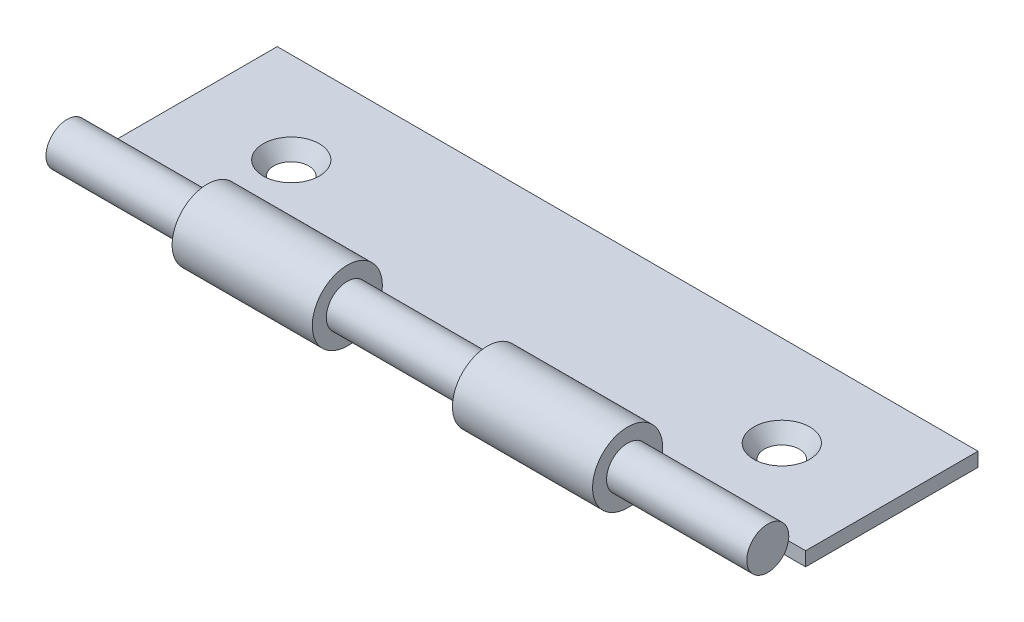
ISO-10303-21;
HEADER;
FILE_DESCRIPTION(('STEP AP214'),'2;1');
FILE_NAME('part.step','',(''),(''),'','','');
FILE_SCHEMA(('AUTOMOTIVE_DESIGN { 1 0 10303 214 1 1 1 1 }'));
ENDSEC;
DATA;
#1=APPLICATION_CONTEXT('core data for automotive mechanical design processes');
#2=APPLICATION_PROTOCOL_DEFINITION('international standard','automotive_design',2000,#1);
#3=PRODUCT_CONTEXT('',#1,'mechanical');
#4=PRODUCT('Part','Part','',(#3));
#5=PRODUCT_RELATED_PRODUCT_CATEGORY('part','',(#4));
#6=PRODUCT_DEFINITION_FORMATION('','',#4);
#7=PRODUCT_DEFINITION_CONTEXT('part definition',#1,'design');
#8=PRODUCT_DEFINITION('design','',#6,#7);
#9=PRODUCT_DEFINITION_SHAPE('','',#8);
#10=(LENGTH_UNIT() NAMED_UNIT(*) SI_UNIT(.MILLI.,.METRE.));
#11=(NAMED_UNIT(*) PLANE_ANGLE_UNIT() SI_UNIT($,.RADIAN.));
#12=(NAMED_UNIT(*) SI_UNIT($,.STERADIAN.) SOLID_ANGLE_UNIT());
#13=UNCERTAINTY_MEASURE_WITH_UNIT(LENGTH_MEASURE(1.E-05),#10,'distance_accuracy_value','');
#14=(GEOMETRIC_REPRESENTATION_CONTEXT(3) GLOBAL_UNCERTAINTY_ASSIGNED_CONTEXT((#13)) GLOBAL_UNIT_ASSIGNED_CONTEXT((#10,
#11,#12)) REPRESENTATION_CONTEXT('',''));
#15=CARTESIAN_POINT('',(0.,0.,0.));
#16=DIRECTION('',(0.,0.,1.));
#17=DIRECTION('',(1.,0.,0.));
#18=AXIS2_PLACEMENT_3D('',#15,#16,#17);
#19=CARTESIAN_POINT('',(50.,0.,0.));
#20=DIRECTION('',(-1.,0.,0.));
#21=DIRECTION('',(0.,0.,1.));
#22=AXIS2_PLACEMENT_3D('',#19,#20,#21);
#23=CYLINDRICAL_SURFACE('',#22,2.5);
#24=CARTESIAN_POINT('',(40.,0.,0.));
#25=DIRECTION('',(-1.,0.,0.));
#26=DIRECTION('',(0.,0.,1.));
#27=AXIS2_PLACEMENT_3D('',#24,#25,#26);
#28=CIRCLE('',#27,2.5);
#29=CARTESIAN_POINT('',(40.,-2.5,0.));
#30=VERTEX_POINT('',#29);
#31=CARTESIAN_POINT('',(40.,-1.21202405061584,-2.18654926784849));
#32=VERTEX_POINT('',#31);
#33=EDGE_CURVE('E10',#30,#32,#28,.T.);
#34=ORIENTED_EDGE('',*,*,#33,.T.);
#35=DIRECTION('',(-1.,0.,0.));
#36=VECTOR('',#35,1.);
#37=CARTESIAN_POINT('',(50.,-1.21202405061584,-2.18654926784849));
#38=LINE('',#37,#36);
#39=CARTESIAN_POINT('',(30.,-1.21202405061584,-2.18654926784849));
#40=VERTEX_POINT('',#39);
#41=EDGE_CURVE('E296',#32,#40,#38,.T.);
#42=ORIENTED_EDGE('',*,*,#41,.T.);
#43=CARTESIAN_POINT('',(30.,0.,0.));
#44=DIRECTION('',(1.,0.,0.));
#45=DIRECTION('',(0.,0.,-1.));
#46=AXIS2_PLACEMENT_3D('',#43,#44,#45);
#47=CIRCLE('',#46,2.5);
#48=CARTESIAN_POINT('',(30.,-2.5,0.));
#49=VERTEX_POINT('',#48);
#50=EDGE_CURVE('E227',#40,#49,#47,.T.);
#51=ORIENTED_EDGE('',*,*,#50,.T.);
#52=DIRECTION('',(-1.,0.,0.));
#53=VECTOR('',#52,1.);
#54=CARTESIAN_POINT('',(50.,-2.5,0.));
#55=LINE('',#54,#53);
#56=EDGE_CURVE('E177',#30,#49,#55,.T.);
#57=ORIENTED_EDGE('',*,*,#56,.F.);
#58=EDGE_LOOP('',(#34,#42,#51,#57));
#59=FACE_BOUND('',#58,.T.);
#60=ADVANCED_FACE('F15',(#59),#23,.T.);
#61=CARTESIAN_POINT('',(20.,0.,0.));
#62=DIRECTION('',(-1.,0.,0.));
#63=DIRECTION('',(0.,0.,1.));
#64=AXIS2_PLACEMENT_3D('',#61,#62,#63);
#65=CIRCLE('',#64,2.5);
#66=CARTESIAN_POINT('',(20.,-2.5,0.));
#67=VERTEX_POINT('',#66);
#68=CARTESIAN_POINT('',(20.,-1.21202405061584,-2.18654926784849));
#69=VERTEX_POINT('',#68);
#70=EDGE_CURVE('E214',#67,#69,#65,.T.);
#71=ORIENTED_EDGE('',*,*,#70,.T.);
#72=CARTESIAN_POINT('',(10.,-1.21202405061584,-2.18654926784849));
#73=VERTEX_POINT('',#72);
#74=EDGE_CURVE('E295',#69,#73,#38,.T.);
#75=ORIENTED_EDGE('',*,*,#74,.T.);
#76=CARTESIAN_POINT('',(10.,0.,0.));
#77=DIRECTION('',(1.,0.,0.));
#78=DIRECTION('',(0.,0.,-1.));
#79=AXIS2_PLACEMENT_3D('',#76,#77,#78);
#80=CIRCLE('',#79,2.5);
#81=CARTESIAN_POINT('',(10.,-2.5,0.));
#82=VERTEX_POINT('',#81);
#83=EDGE_CURVE('E254',#73,#82,#80,.T.);
#84=ORIENTED_EDGE('',*,*,#83,.T.);
#85=EDGE_CURVE('E176',#67,#82,#55,.T.);
#86=ORIENTED_EDGE('',*,*,#85,.F.);
#87=EDGE_LOOP('',(#71,#75,#84,#86));
#88=FACE_BOUND('',#87,.T.);
#89=ADVANCED_FACE('F308',(#88),#23,.T.);
#90=CARTESIAN_POINT('',(50.,-0.727214430369505,-1.31192956070909));
#91=DIRECTION('',(0.,0.874619707139396,-0.484809620246337));
#92=DIRECTION('',(0.,0.484809620246337,0.874619707139396));
#93=AXIS2_PLACEMENT_3D('',#90,#91,#92);
#94=PLANE('',#93);
#95=ORIENTED_EDGE('',*,*,#41,.F.);
#96=DIRECTION('',(0.,0.484809620246337,0.874619707139396));
#97=VECTOR('',#96,1.);
#98=CARTESIAN_POINT('',(40.,-0.727214430369505,-1.31192956070909));
#99=LINE('',#98,#97);
#100=CARTESIAN_POINT('',(40.,-0.727214430369505,-1.31192956070909));
#101=VERTEX_POINT('',#100);
#102=EDGE_CURVE('E141',#32,#101,#99,.T.);
#103=ORIENTED_EDGE('',*,*,#102,.T.);
#104=DIRECTION('',(-1.,0.,0.));
#105=VECTOR('',#104,1.);
#106=CARTESIAN_POINT('',(50.,-0.727214430369505,-1.31192956070909));
#107=LINE('',#106,#105);
#108=CARTESIAN_POINT('',(30.,-0.727214430369505,-1.31192956070909));
#109=VERTEX_POINT('',#108);
#110=EDGE_CURVE('E135',#101,#109,#107,.T.);
#111=ORIENTED_EDGE('',*,*,#110,.T.);
#112=DIRECTION('',(0.,-0.484809620246337,-0.874619707139396));
#113=VECTOR('',#112,1.);
#114=CARTESIAN_POINT('',(30.,-0.727214430369505,-1.31192956070909));
#115=LINE('',#114,#113);
#116=EDGE_CURVE('E188',#109,#40,#115,.T.);
#117=ORIENTED_EDGE('',*,*,#116,.T.);
#118=EDGE_LOOP('',(#95,#103,#111,#117));
#119=FACE_BOUND('',#118,.T.);
#120=ADVANCED_FACE('F377',(#119),#94,.F.);
#121=CARTESIAN_POINT('',(50.,-2.5,0.));
#122=DIRECTION('',(0.,1.,0.));
#123=DIRECTION('',(1.,0.,0.));
#124=AXIS2_PLACEMENT_3D('',#121,#122,#123);
#125=PLANE('',#124);
#126=DIRECTION('',(1.,0.,0.));
#127=VECTOR('',#126,1.);
#128=CARTESIAN_POINT('',(40.,-2.5,-2.7));
#129=LINE('',#128,#127);
#130=CARTESIAN_POINT('',(40.,-2.5,-2.7));
#131=VERTEX_POINT('',#130);
#132=CARTESIAN_POINT('',(50.,-2.5,-2.7));
#133=VERTEX_POINT('',#132);
#134=EDGE_CURVE('E30',#131,#133,#129,.T.);
#135=ORIENTED_EDGE('',*,*,#134,.F.);
#136=DIRECTION('',(0.,0.,-1.));
#137=VECTOR('',#136,1.);
#138=CARTESIAN_POINT('',(40.,-2.5,-0.1));
#139=LINE('',#138,#137);
#140=EDGE_CURVE('E341',#30,#131,#139,.T.);
#141=ORIENTED_EDGE('',*,*,#140,.F.);
#142=ORIENTED_EDGE('',*,*,#56,.T.);
#143=DIRECTION('',(0.,0.,1.));
#144=VECTOR('',#143,1.);
#145=CARTESIAN_POINT('',(30.,-2.5,-0.1));
#146=LINE('',#145,#144);
#147=CARTESIAN_POINT('',(30.,-2.5,-2.7));
#148=VERTEX_POINT('',#147);
#149=EDGE_CURVE('E222',#148,#49,#146,.T.);
#150=ORIENTED_EDGE('',*,*,#149,.F.);
#151=DIRECTION('',(1.,0.,0.));
#152=VECTOR('',#151,1.);
#153=CARTESIAN_POINT('',(20.,-2.5,-2.7));
#154=LINE('',#153,#152);
#155=CARTESIAN_POINT('',(20.,-2.5,-2.7));
#156=VERTEX_POINT('',#155);
#157=EDGE_CURVE('E211',#156,#148,#154,.T.);
#158=ORIENTED_EDGE('',*,*,#157,.F.);
#159=DIRECTION('',(0.,0.,-1.));
#160=VECTOR('',#159,1.);
#161=CARTESIAN_POINT('',(20.,-2.5,-0.1));
#162=LINE('',#161,#160);
#163=EDGE_CURVE('E150',#67,#156,#162,.T.);
#164=ORIENTED_EDGE('',*,*,#163,.F.);
#165=ORIENTED_EDGE('',*,*,#85,.T.);
#166=DIRECTION('',(0.,0.,1.));
#167=VECTOR('',#166,1.);
#168=CARTESIAN_POINT('',(10.,-2.5,-0.1));
#169=LINE('',#168,#167);
#170=CARTESIAN_POINT('',(10.,-2.5,-2.7));
#171=VERTEX_POINT('',#170);
#172=EDGE_CURVE('E243',#171,#82,#169,.T.);
#173=ORIENTED_EDGE('',*,*,#172,.F.);
#174=DIRECTION('',(1.,0.,0.));
#175=VECTOR('',#174,1.);
#176=CARTESIAN_POINT('',(0.,-2.5,-2.7));
#177=LINE('',#176,#175);
#178=CARTESIAN_POINT('',(0.,-2.5,-2.7));
#179=VERTEX_POINT('',#178);
#180=EDGE_CURVE('E236',#179,#171,#177,.T.);
#181=ORIENTED_EDGE('',*,*,#180,.F.);
#182=DIRECTION('',(0.,0.,-1.));
#183=VECTOR('',#182,1.);
#184=CARTESIAN_POINT('',(0.,-2.5,0.));
#185=LINE('',#184,#183);
#186=CARTESIAN_POINT('',(0.,-2.5,-15.));
#187=VERTEX_POINT('',#186);
#188=EDGE_CURVE('E276',#179,#187,#185,.T.);
#189=ORIENTED_EDGE('',*,*,#188,.T.);
#190=DIRECTION('',(-1.,0.,0.));
#191=VECTOR('',#190,1.);
#192=CARTESIAN_POINT('',(50.,-2.5,-15.));
#193=LINE('',#192,#191);
#194=CARTESIAN_POINT('',(50.,-2.5,-15.));
#195=VERTEX_POINT('',#194);
#196=EDGE_CURVE('E167',#195,#187,#193,.T.);
#197=ORIENTED_EDGE('',*,*,#196,.F.);
#198=DIRECTION('',(0.,0.,-1.));
#199=VECTOR('',#198,1.);
#200=CARTESIAN_POINT('',(50.,-2.5,0.));
#201=LINE('',#200,#199);
#202=EDGE_CURVE('E286',#133,#195,#201,.T.);
#203=ORIENTED_EDGE('',*,*,#202,.F.);
#204=EDGE_LOOP('',(#135,#141,#142,#150,#158,#164,#165,#173,#181,#189,#197,#203));
#205=FACE_BOUND('',#204,.T.);
#206=CARTESIAN_POINT('',(7.5,-2.5,-8.5));
#207=DIRECTION('',(0.,-1.,0.));
#208=DIRECTION('',(1.,0.,0.));
#209=AXIS2_PLACEMENT_3D('',#206,#207,#208);
#210=CIRCLE('',#209,1.25);
#211=CARTESIAN_POINT('',(8.75,-2.5,-8.5));
#212=VERTEX_POINT('',#211);
#213=EDGE_CURVE('E269',#212,#212,#210,.T.);
#214=ORIENTED_EDGE('',*,*,#213,.F.);
#215=EDGE_LOOP('',(#214));
#216=FACE_BOUND('',#215,.T.);
#217=CARTESIAN_POINT('',(42.5,-2.5,-8.5));
#218=DIRECTION('',(0.,-1.,0.));
#219=DIRECTION('',(1.,0.,0.));
#220=AXIS2_PLACEMENT_3D('',#217,#218,#219);
#221=CIRCLE('',#220,1.25);
#222=CARTESIAN_POINT('',(43.75,-2.5,-8.5));
#223=VERTEX_POINT('',#222);
#224=EDGE_CURVE('E261',#223,#223,#221,.T.);
#225=ORIENTED_EDGE('',*,*,#224,.F.);
#226=EDGE_LOOP('',(#225));
#227=FACE_BOUND('',#226,.T.);
#228=ADVANCED_FACE('F329',(#205,#216,#227),#125,.F.);
#229=CARTESIAN_POINT('',(50.,-1.5,0.));
#230=DIRECTION('',(0.,1.,0.));
#231=DIRECTION('',(1.,0.,0.));
#232=AXIS2_PLACEMENT_3D('',#229,#230,#231);
#233=PLANE('',#232);
#234=DIRECTION('',(0.,0.,1.));
#235=VECTOR('',#234,1.);
#236=CARTESIAN_POINT('',(40.,-1.5,0.));
#237=LINE('',#236,#235);
#238=CARTESIAN_POINT('',(40.,-1.5,-2.7));
#239=VERTEX_POINT('',#238);
#240=CARTESIAN_POINT('',(40.,-1.5,0.));
#241=VERTEX_POINT('',#240);
#242=EDGE_CURVE('E140',#239,#241,#237,.T.);
#243=ORIENTED_EDGE('',*,*,#242,.F.);
#244=DIRECTION('',(-1.,0.,0.));
#245=VECTOR('',#244,1.);
#246=CARTESIAN_POINT('',(50.,-1.5,-2.7));
#247=LINE('',#246,#245);
#248=CARTESIAN_POINT('',(50.,-1.5,-2.7));
#249=VERTEX_POINT('',#248);
#250=EDGE_CURVE('E349',#249,#239,#247,.T.);
#251=ORIENTED_EDGE('',*,*,#250,.F.);
#252=DIRECTION('',(0.,0.,-1.));
#253=VECTOR('',#252,1.);
#254=CARTESIAN_POINT('',(50.,-1.5,0.));
#255=LINE('',#254,#253);
#256=CARTESIAN_POINT('',(50.,-1.5,-15.));
#257=VERTEX_POINT('',#256);
#258=EDGE_CURVE('E293',#249,#257,#255,.T.);
#259=ORIENTED_EDGE('',*,*,#258,.T.);
#260=DIRECTION('',(-1.,0.,0.));
#261=VECTOR('',#260,1.);
#262=CARTESIAN_POINT('',(50.,-1.5,-15.));
#263=LINE('',#262,#261);
#264=CARTESIAN_POINT('',(0.,-1.5,-15.));
#265=VERTEX_POINT('',#264);
#266=EDGE_CURVE('E158',#257,#265,#263,.T.);
#267=ORIENTED_EDGE('',*,*,#266,.T.);
#268=DIRECTION('',(0.,0.,-1.));
#269=VECTOR('',#268,1.);
#270=CARTESIAN_POINT('',(0.,-1.5,0.));
#271=LINE('',#270,#269);
#272=CARTESIAN_POINT('',(0.,-1.5,-2.7));
#273=VERTEX_POINT('',#272);
#274=EDGE_CURVE('E283',#273,#265,#271,.T.);
#275=ORIENTED_EDGE('',*,*,#274,.F.);
#276=DIRECTION('',(-1.,0.,0.));
#277=VECTOR('',#276,1.);
#278=CARTESIAN_POINT('',(50.,-1.5,-2.7));
#279=LINE('',#278,#277);
#280=CARTESIAN_POINT('',(10.,-1.5,-2.7));
#281=VERTEX_POINT('',#280);
#282=EDGE_CURVE('E247',#281,#273,#279,.T.);
#283=ORIENTED_EDGE('',*,*,#282,.F.);
#284=DIRECTION('',(0.,0.,-1.));
#285=VECTOR('',#284,1.);
#286=CARTESIAN_POINT('',(10.,-1.5,0.));
#287=LINE('',#286,#285);
#288=CARTESIAN_POINT('',(10.,-1.5,0.));
#289=VERTEX_POINT('',#288);
#290=EDGE_CURVE('E258',#289,#281,#287,.T.);
#291=ORIENTED_EDGE('',*,*,#290,.F.);
#292=DIRECTION('',(-1.,0.,0.));
#293=VECTOR('',#292,1.);
#294=CARTESIAN_POINT('',(50.,-1.5,0.));
#295=LINE('',#294,#293);
#296=CARTESIAN_POINT('',(20.,-1.5,0.));
#297=VERTEX_POINT('',#296);
#298=EDGE_CURVE('E159',#297,#289,#295,.T.);
#299=ORIENTED_EDGE('',*,*,#298,.F.);
#300=DIRECTION('',(0.,0.,1.));
#301=VECTOR('',#300,1.);
#302=CARTESIAN_POINT('',(20.,-1.5,0.));
#303=LINE('',#302,#301);
#304=CARTESIAN_POINT('',(20.,-1.5,-2.7));
#305=VERTEX_POINT('',#304);
#306=EDGE_CURVE('E207',#305,#297,#303,.T.);
#307=ORIENTED_EDGE('',*,*,#306,.F.);
#308=DIRECTION('',(-1.,0.,0.));
#309=VECTOR('',#308,1.);
#310=CARTESIAN_POINT('',(50.,-1.5,-2.7));
#311=LINE('',#310,#309);
#312=CARTESIAN_POINT('',(30.,-1.5,-2.7));
#313=VERTEX_POINT('',#312);
#314=EDGE_CURVE('E23',#313,#305,#311,.T.);
#315=ORIENTED_EDGE('',*,*,#314,.F.);
#316=DIRECTION('',(0.,0.,-1.));
#317=VECTOR('',#316,1.);
#318=CARTESIAN_POINT('',(30.,-1.5,0.));
#319=LINE('',#318,#317);
#320=CARTESIAN_POINT('',(30.,-1.5,0.));
#321=VERTEX_POINT('',#320);
#322=EDGE_CURVE('E156',#321,#313,#319,.T.);
#323=ORIENTED_EDGE('',*,*,#322,.F.);
#324=EDGE_CURVE('E132',#241,#321,#295,.T.);
#325=ORIENTED_EDGE('',*,*,#324,.F.);
#326=EDGE_LOOP('',(#243,#251,#259,#267,#275,#283,#291,#299,#307,#315,#323,#325));
#327=FACE_BOUND('',#326,.T.);
#328=CARTESIAN_POINT('',(7.5,-1.5,-8.5));
#329=DIRECTION('',(0.,-1.,0.));
#330=DIRECTION('',(1.,0.,0.));
#331=AXIS2_PLACEMENT_3D('',#328,#329,#330);
#332=CIRCLE('',#331,2.);
#333=CARTESIAN_POINT('',(9.5,-1.5,-8.5));
#334=VERTEX_POINT('',#333);
#335=EDGE_CURVE('E273',#334,#334,#332,.T.);
#336=ORIENTED_EDGE('',*,*,#335,.T.);
#337=EDGE_LOOP('',(#336));
#338=FACE_BOUND('',#337,.T.);
#339=CARTESIAN_POINT('',(42.5,-1.5,-8.5));
#340=DIRECTION('',(0.,-1.,0.));
#341=DIRECTION('',(1.,0.,0.));
#342=AXIS2_PLACEMENT_3D('',#339,#340,#341);
#343=CIRCLE('',#342,2.);
#344=CARTESIAN_POINT('',(44.5,-1.5,-8.5));
#345=VERTEX_POINT('',#344);
#346=EDGE_CURVE('E265',#345,#345,#343,.T.);
#347=ORIENTED_EDGE('',*,*,#346,.T.);
#348=EDGE_LOOP('',(#347));
#349=FACE_BOUND('',#348,.T.);
#350=ADVANCED_FACE('F153',(#327,#338,#349),#233,.T.);
#351=CARTESIAN_POINT('',(50.,-1.5,-15.));
#352=DIRECTION('',(0.,0.,-1.));
#353=DIRECTION('',(-1.,0.,0.));
#354=AXIS2_PLACEMENT_3D('',#351,#352,#353);
#355=PLANE('',#354);
#356=DIRECTION('',(0.,-1.,0.));
#357=VECTOR('',#356,1.);
#358=CARTESIAN_POINT('',(0.,-1.5,-15.));
#359=LINE('',#358,#357);
#360=EDGE_CURVE('E279',#265,#187,#359,.T.);
#361=ORIENTED_EDGE('',*,*,#360,.F.);
#362=ORIENTED_EDGE('',*,*,#266,.F.);
#363=DIRECTION('',(0.,-1.,0.));
#364=VECTOR('',#363,1.);
#365=CARTESIAN_POINT('',(50.,-1.5,-15.));
#366=LINE('',#365,#364);
#367=EDGE_CURVE('E289',#257,#195,#366,.T.);
#368=ORIENTED_EDGE('',*,*,#367,.T.);
#369=ORIENTED_EDGE('',*,*,#196,.T.);
#370=EDGE_LOOP('',(#361,#362,#368,#369));
#371=FACE_BOUND('',#370,.T.);
#372=ADVANCED_FACE('F333',(#371),#355,.T.);
#373=ORIENTED_EDGE('',*,*,#74,.F.);
#374=DIRECTION('',(0.,0.484809620246337,0.874619707139396));
#375=VECTOR('',#374,1.);
#376=CARTESIAN_POINT('',(20.,-0.727214430369505,-1.31192956070909));
#377=LINE('',#376,#375);
#378=CARTESIAN_POINT('',(20.,-0.727214430369505,-1.31192956070909));
#379=VERTEX_POINT('',#378);
#380=EDGE_CURVE('E184',#69,#379,#377,.T.);
#381=ORIENTED_EDGE('',*,*,#380,.T.);
#382=CARTESIAN_POINT('',(10.,-0.727214430369505,-1.31192956070909));
#383=VERTEX_POINT('',#382);
#384=EDGE_CURVE('E38',#379,#383,#107,.T.);
#385=ORIENTED_EDGE('',*,*,#384,.T.);
#386=DIRECTION('',(0.,-0.484809620246337,-0.874619707139396));
#387=VECTOR('',#386,1.);
#388=CARTESIAN_POINT('',(10.,-0.727214430369505,-1.31192956070909));
#389=LINE('',#388,#387);
#390=EDGE_CURVE('E180',#383,#73,#389,.T.);
#391=ORIENTED_EDGE('',*,*,#390,.T.);
#392=EDGE_LOOP('',(#373,#381,#385,#391));
#393=FACE_BOUND('',#392,.T.);
#394=ADVANCED_FACE('F316',(#393),#94,.F.);
#395=CARTESIAN_POINT('',(50.,0.,0.));
#396=DIRECTION('',(1.,0.,0.));
#397=DIRECTION('',(0.,0.,-1.));
#398=AXIS2_PLACEMENT_3D('',#395,#396,#397);
#399=PLANE('',#398);
#400=DIRECTION('',(0.,-1.,0.));
#401=VECTOR('',#400,1.);
#402=CARTESIAN_POINT('',(50.,0.,-2.7));
#403=LINE('',#402,#401);
#404=EDGE_CURVE('E339',#249,#133,#403,.T.);
#405=ORIENTED_EDGE('',*,*,#404,.T.);
#406=ORIENTED_EDGE('',*,*,#202,.T.);
#407=ORIENTED_EDGE('',*,*,#367,.F.);
#408=ORIENTED_EDGE('',*,*,#258,.F.);
#409=EDGE_LOOP('',(#405,#406,#407,#408));
#410=FACE_BOUND('',#409,.T.);
#411=ADVANCED_FACE('F338',(#410),#399,.T.);
#412=CARTESIAN_POINT('',(0.,0.,0.));
#413=DIRECTION('',(1.,0.,0.));
#414=DIRECTION('',(0.,0.,-1.));
#415=AXIS2_PLACEMENT_3D('',#412,#413,#414);
#416=PLANE('',#415);
#417=ORIENTED_EDGE('',*,*,#188,.F.);
#418=DIRECTION('',(0.,1.,0.));
#419=VECTOR('',#418,1.);
#420=CARTESIAN_POINT('',(0.,0.,-2.7));
#421=LINE('',#420,#419);
#422=EDGE_CURVE('E232',#179,#273,#421,.T.);
#423=ORIENTED_EDGE('',*,*,#422,.T.);
#424=ORIENTED_EDGE('',*,*,#274,.T.);
#425=ORIENTED_EDGE('',*,*,#360,.T.);
#426=EDGE_LOOP('',(#417,#423,#424,#425));
#427=FACE_BOUND('',#426,.T.);
#428=ADVANCED_FACE('F325',(#427),#416,.F.);
#429=CARTESIAN_POINT('',(7.5,-1.5,-8.5));
#430=DIRECTION('',(0.,1.,0.));
#431=DIRECTION('',(-1.,0.,0.));
#432=AXIS2_PLACEMENT_3D('',#429,#430,#431);
#433=CONICAL_SURFACE('',#432,2.,0.643501108793284);
#434=ORIENTED_EDGE('',*,*,#213,.T.);
#435=EDGE_LOOP('',(#434));
#436=FACE_BOUND('',#435,.T.);
#437=ORIENTED_EDGE('',*,*,#335,.F.);
#438=EDGE_LOOP('',(#437));
#439=FACE_BOUND('',#438,.T.);
#440=ADVANCED_FACE('F461',(#436,#439),#433,.F.);
#441=CARTESIAN_POINT('',(42.5,-1.5,-8.5));
#442=DIRECTION('',(0.,1.,0.));
#443=DIRECTION('',(-1.,0.,0.));
#444=AXIS2_PLACEMENT_3D('',#441,#442,#443);
#445=CONICAL_SURFACE('',#444,2.,0.643501108793284);
#446=ORIENTED_EDGE('',*,*,#224,.T.);
#447=EDGE_LOOP('',(#446));
#448=FACE_BOUND('',#447,.T.);
#449=ORIENTED_EDGE('',*,*,#346,.F.);
#450=EDGE_LOOP('',(#449));
#451=FACE_BOUND('',#450,.T.);
#452=ADVANCED_FACE('F458',(#448,#451),#445,.F.);
#453=CARTESIAN_POINT('',(10.,0.,-0.1));
#454=DIRECTION('',(1.,0.,0.));
#455=DIRECTION('',(0.,0.,-1.));
#456=AXIS2_PLACEMENT_3D('',#453,#454,#455);
#457=PLANE('',#456);
#458=ORIENTED_EDGE('',*,*,#83,.F.);
#459=ORIENTED_EDGE('',*,*,#390,.F.);
#460=CARTESIAN_POINT('',(10.,0.,0.));
#461=DIRECTION('',(1.,0.,0.));
#462=DIRECTION('',(0.,0.,-1.));
#463=AXIS2_PLACEMENT_3D('',#460,#461,#462);
#464=CIRCLE('',#463,1.5);
#465=EDGE_CURVE('E250',#383,#289,#464,.T.);
#466=ORIENTED_EDGE('',*,*,#465,.T.);
#467=ORIENTED_EDGE('',*,*,#290,.T.);
#468=DIRECTION('',(0.,-1.,0.));
#469=VECTOR('',#468,1.);
#470=CARTESIAN_POINT('',(10.,0.,-2.7));
#471=LINE('',#470,#469);
#472=EDGE_CURVE('E240',#281,#171,#471,.T.);
#473=ORIENTED_EDGE('',*,*,#472,.T.);
#474=ORIENTED_EDGE('',*,*,#172,.T.);
#475=EDGE_LOOP('',(#458,#459,#466,#467,#473,#474));
#476=FACE_BOUND('',#475,.T.);
#477=ADVANCED_FACE('F314',(#476),#457,.F.);
#478=CARTESIAN_POINT('',(0.,0.,-2.7));
#479=DIRECTION('',(0.,0.,-1.));
#480=DIRECTION('',(-1.,0.,0.));
#481=AXIS2_PLACEMENT_3D('',#478,#479,#480);
#482=PLANE('',#481);
#483=ORIENTED_EDGE('',*,*,#282,.T.);
#484=ORIENTED_EDGE('',*,*,#422,.F.);
#485=ORIENTED_EDGE('',*,*,#180,.T.);
#486=ORIENTED_EDGE('',*,*,#472,.F.);
#487=EDGE_LOOP('',(#483,#484,#485,#486));
#488=FACE_BOUND('',#487,.T.);
#489=ADVANCED_FACE('F321',(#488),#482,.F.);
#490=CARTESIAN_POINT('',(30.,0.,-0.1));
#491=DIRECTION('',(1.,0.,0.));
#492=DIRECTION('',(0.,0.,-1.));
#493=AXIS2_PLACEMENT_3D('',#490,#491,#492);
#494=PLANE('',#493);
#495=ORIENTED_EDGE('',*,*,#50,.F.);
#496=ORIENTED_EDGE('',*,*,#116,.F.);
#497=CARTESIAN_POINT('',(30.,0.,0.));
#498=DIRECTION('',(1.,0.,0.));
#499=DIRECTION('',(0.,0.,-1.));
#500=AXIS2_PLACEMENT_3D('',#497,#498,#499);
#501=CIRCLE('',#500,1.5);
#502=EDGE_CURVE('E219',#109,#321,#501,.T.);
#503=ORIENTED_EDGE('',*,*,#502,.T.);
#504=ORIENTED_EDGE('',*,*,#322,.T.);
#505=DIRECTION('',(0.,-1.,0.));
#506=VECTOR('',#505,1.);
#507=CARTESIAN_POINT('',(30.,0.,-2.7));
#508=LINE('',#507,#506);
#509=EDGE_CURVE('E202',#313,#148,#508,.T.);
#510=ORIENTED_EDGE('',*,*,#509,.T.);
#511=ORIENTED_EDGE('',*,*,#149,.T.);
#512=EDGE_LOOP('',(#495,#496,#503,#504,#510,#511));
#513=FACE_BOUND('',#512,.T.);
#514=ADVANCED_FACE('F370',(#513),#494,.F.);
#515=CARTESIAN_POINT('',(20.,0.,-0.1));
#516=DIRECTION('',(-1.,0.,0.));
#517=DIRECTION('',(0.,0.,1.));
#518=AXIS2_PLACEMENT_3D('',#515,#516,#517);
#519=PLANE('',#518);
#520=ORIENTED_EDGE('',*,*,#163,.T.);
#521=DIRECTION('',(0.,1.,0.));
#522=VECTOR('',#521,1.);
#523=CARTESIAN_POINT('',(20.,0.,-2.7));
#524=LINE('',#523,#522);
#525=EDGE_CURVE('E200',#156,#305,#524,.T.);
#526=ORIENTED_EDGE('',*,*,#525,.T.);
#527=ORIENTED_EDGE('',*,*,#306,.T.);
#528=CARTESIAN_POINT('',(20.,0.,0.));
#529=DIRECTION('',(-1.,0.,0.));
#530=DIRECTION('',(0.,0.,1.));
#531=AXIS2_PLACEMENT_3D('',#528,#529,#530);
#532=CIRCLE('',#531,1.5);
#533=EDGE_CURVE('E215',#297,#379,#532,.T.);
#534=ORIENTED_EDGE('',*,*,#533,.T.);
#535=ORIENTED_EDGE('',*,*,#380,.F.);
#536=ORIENTED_EDGE('',*,*,#70,.F.);
#537=EDGE_LOOP('',(#520,#526,#527,#534,#535,#536));
#538=FACE_BOUND('',#537,.T.);
#539=ADVANCED_FACE('F206',(#538),#519,.F.);
#540=CARTESIAN_POINT('',(20.,0.,-2.7));
#541=DIRECTION('',(0.,0.,-1.));
#542=DIRECTION('',(-1.,0.,0.));
#543=AXIS2_PLACEMENT_3D('',#540,#541,#542);
#544=PLANE('',#543);
#545=ORIENTED_EDGE('',*,*,#314,.T.);
#546=ORIENTED_EDGE('',*,*,#525,.F.);
#547=ORIENTED_EDGE('',*,*,#157,.T.);
#548=ORIENTED_EDGE('',*,*,#509,.F.);
#549=EDGE_LOOP('',(#545,#546,#547,#548));
#550=FACE_BOUND('',#549,.T.);
#551=ADVANCED_FACE('F198',(#550),#544,.F.);
#552=CARTESIAN_POINT('',(40.,0.,-0.1));
#553=DIRECTION('',(-1.,0.,0.));
#554=DIRECTION('',(0.,0.,1.));
#555=AXIS2_PLACEMENT_3D('',#552,#553,#554);
#556=PLANE('',#555);
#557=ORIENTED_EDGE('',*,*,#242,.T.);
#558=CARTESIAN_POINT('',(40.,0.,0.));
#559=DIRECTION('',(-1.,0.,0.));
#560=DIRECTION('',(0.,0.,1.));
#561=AXIS2_PLACEMENT_3D('',#558,#559,#560);
#562=CIRCLE('',#561,1.5);
#563=EDGE_CURVE('E127',#241,#101,#562,.T.);
#564=ORIENTED_EDGE('',*,*,#563,.T.);
#565=ORIENTED_EDGE('',*,*,#102,.F.);
#566=ORIENTED_EDGE('',*,*,#33,.F.);
#567=ORIENTED_EDGE('',*,*,#140,.T.);
#568=DIRECTION('',(0.,1.,0.));
#569=VECTOR('',#568,1.);
#570=CARTESIAN_POINT('',(40.,0.,-2.7));
#571=LINE('',#570,#569);
#572=EDGE_CURVE('E146',#131,#239,#571,.T.);
#573=ORIENTED_EDGE('',*,*,#572,.T.);
#574=EDGE_LOOP('',(#557,#564,#565,#566,#567,#573));
#575=FACE_BOUND('',#574,.T.);
#576=ADVANCED_FACE('F145',(#575),#556,.F.);
#577=CARTESIAN_POINT('',(40.,0.,-2.7));
#578=DIRECTION('',(0.,0.,-1.));
#579=DIRECTION('',(-1.,0.,0.));
#580=AXIS2_PLACEMENT_3D('',#577,#578,#579);
#581=PLANE('',#580);
#582=ORIENTED_EDGE('',*,*,#250,.T.);
#583=ORIENTED_EDGE('',*,*,#572,.F.);
#584=ORIENTED_EDGE('',*,*,#134,.T.);
#585=ORIENTED_EDGE('',*,*,#404,.F.);
#586=EDGE_LOOP('',(#582,#583,#584,#585));
#587=FACE_BOUND('',#586,.T.);
#588=ADVANCED_FACE('F437',(#587),#581,.F.);
#589=CARTESIAN_POINT('',(0.,0.,0.));
#590=DIRECTION('',(1.,0.,0.));
#591=DIRECTION('',(0.,1.,0.));
#592=AXIS2_PLACEMENT_3D('',#589,#590,#591);
#593=CYLINDRICAL_SURFACE('',#592,1.5);
#594=ORIENTED_EDGE('',*,*,#502,.F.);
#595=ORIENTED_EDGE('',*,*,#110,.F.);
#596=ORIENTED_EDGE('',*,*,#563,.F.);
#597=ORIENTED_EDGE('',*,*,#324,.T.);
#598=EDGE_LOOP('',(#594,#595,#596,#597));
#599=FACE_BOUND('',#598,.T.);
#600=CARTESIAN_POINT('',(50.,0.,0.));
#601=DIRECTION('',(-1.,0.,0.));
#602=DIRECTION('',(0.,1.,0.));
#603=AXIS2_PLACEMENT_3D('',#600,#601,#602);
#604=CIRCLE('',#603,1.5);
#605=CARTESIAN_POINT('',(50.,1.5,0.));
#606=VERTEX_POINT('',#605);
#607=EDGE_CURVE('E436',#606,#606,#604,.T.);
#608=ORIENTED_EDGE('',*,*,#607,.T.);
#609=EDGE_LOOP('',(#608));
#610=FACE_BOUND('',#609,.T.);
#611=CARTESIAN_POINT('',(0.,0.,0.));
#612=DIRECTION('',(1.,0.,0.));
#613=DIRECTION('',(0.,1.,0.));
#614=AXIS2_PLACEMENT_3D('',#611,#612,#613);
#615=CIRCLE('',#614,1.5);
#616=CARTESIAN_POINT('',(0.,1.5,0.));
#617=VERTEX_POINT('',#616);
#618=EDGE_CURVE('E548',#617,#617,#615,.T.);
#619=ORIENTED_EDGE('',*,*,#618,.T.);
#620=EDGE_LOOP('',(#619));
#621=FACE_BOUND('',#620,.T.);
#622=ORIENTED_EDGE('',*,*,#465,.F.);
#623=ORIENTED_EDGE('',*,*,#384,.F.);
#624=ORIENTED_EDGE('',*,*,#533,.F.);
#625=ORIENTED_EDGE('',*,*,#298,.T.);
#626=EDGE_LOOP('',(#622,#623,#624,#625));
#627=FACE_BOUND('',#626,.T.);
#628=ADVANCED_FACE('F129',(#599,#610,#621,#627),#593,.T.);
#629=CARTESIAN_POINT('',(50.,0.,0.));
#630=DIRECTION('',(1.,0.,0.));
#631=DIRECTION('',(0.,0.,-1.));
#632=AXIS2_PLACEMENT_3D('',#629,#630,#631);
#633=PLANE('',#632);
#634=ORIENTED_EDGE('',*,*,#607,.F.);
#635=EDGE_LOOP('',(#634));
#636=FACE_BOUND('',#635,.T.);
#637=ADVANCED_FACE('F444',(#636),#633,.T.);
#638=CARTESIAN_POINT('',(0.,0.,0.));
#639=DIRECTION('',(-1.,0.,0.));
#640=DIRECTION('',(0.,0.,1.));
#641=AXIS2_PLACEMENT_3D('',#638,#639,#640);
#642=PLANE('',#641);
#643=ORIENTED_EDGE('',*,*,#618,.F.);
#644=EDGE_LOOP('',(#643));
#645=FACE_BOUND('',#644,.T.);
#646=ADVANCED_FACE('F532',(#645),#642,.T.);
#647=CLOSED_SHELL('',(#60,#89,#120,#228,#350,#372,#394,#411,#428,#440,#452,#477,#489,#514,#539,
#551,#576,#588,#628,#637,#646));
#648=MANIFOLD_SOLID_BREP('B1',#647);
#649=ADVANCED_BREP_SHAPE_REPRESENTATION('',(#18,#648),#14);
#650=SHAPE_DEFINITION_REPRESENTATION(#9,#649);
ENDSEC;
END-ISO-10303-21;
